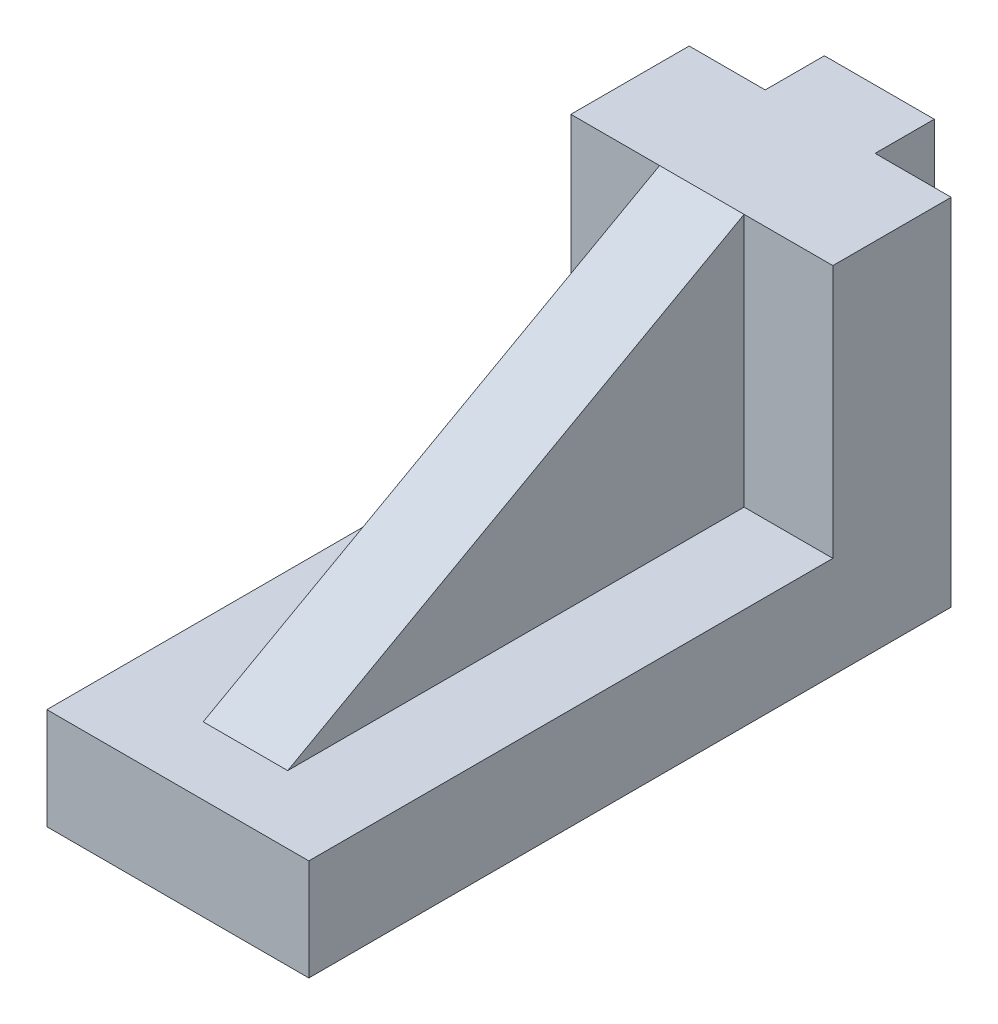
ISO-10303-21;
HEADER;
FILE_DESCRIPTION(('STEP AP214'),'2;1');
FILE_NAME('part.step','',(''),(''),'','','');
FILE_SCHEMA(('AUTOMOTIVE_DESIGN { 1 0 10303 214 1 1 1 1 }'));
ENDSEC;
DATA;
#1=APPLICATION_CONTEXT('core data for automotive mechanical design processes');
#2=APPLICATION_PROTOCOL_DEFINITION('international standard','automotive_design',2000,#1);
#3=PRODUCT_CONTEXT('',#1,'mechanical');
#4=PRODUCT('Part','Part','',(#3));
#5=PRODUCT_RELATED_PRODUCT_CATEGORY('part','',(#4));
#6=PRODUCT_DEFINITION_FORMATION('','',#4);
#7=PRODUCT_DEFINITION_CONTEXT('part definition',#1,'design');
#8=PRODUCT_DEFINITION('design','',#6,#7);
#9=PRODUCT_DEFINITION_SHAPE('','',#8);
#10=(LENGTH_UNIT() NAMED_UNIT(*) SI_UNIT(.MILLI.,.METRE.));
#11=(NAMED_UNIT(*) PLANE_ANGLE_UNIT() SI_UNIT($,.RADIAN.));
#12=(NAMED_UNIT(*) SI_UNIT($,.STERADIAN.) SOLID_ANGLE_UNIT());
#13=UNCERTAINTY_MEASURE_WITH_UNIT(LENGTH_MEASURE(1.E-05),#10,'distance_accuracy_value','');
#14=(GEOMETRIC_REPRESENTATION_CONTEXT(3) GLOBAL_UNCERTAINTY_ASSIGNED_CONTEXT((#13)) GLOBAL_UNIT_ASSIGNED_CONTEXT((#10,
#11,#12)) REPRESENTATION_CONTEXT('',''));
#15=CARTESIAN_POINT('',(0.,0.,0.));
#16=DIRECTION('',(0.,0.,1.));
#17=DIRECTION('',(1.,0.,0.));
#18=AXIS2_PLACEMENT_3D('',#15,#16,#17);
#19=CARTESIAN_POINT('',(15.5,42.,14.));
#20=DIRECTION('',(0.,0.,-1.));
#21=DIRECTION('',(0.,1.,0.));
#22=AXIS2_PLACEMENT_3D('',#19,#20,#21);
#23=PLANE('',#22);
#24=DIRECTION('',(0.,-1.,0.));
#25=VECTOR('',#24,1.);
#26=CARTESIAN_POINT('',(-5.,42.,14.));
#27=LINE('',#26,#25);
#28=CARTESIAN_POINT('',(-5.,42.,14.));
#29=VERTEX_POINT('',#28);
#30=CARTESIAN_POINT('',(-5.,12.,14.));
#31=VERTEX_POINT('',#30);
#32=EDGE_CURVE('E53',#29,#31,#27,.T.);
#33=ORIENTED_EDGE('',*,*,#32,.F.);
#34=DIRECTION('',(-1.,0.,0.));
#35=VECTOR('',#34,1.);
#36=CARTESIAN_POINT('',(15.5,42.,14.));
#37=LINE('',#36,#35);
#38=CARTESIAN_POINT('',(-15.5,42.,14.));
#39=VERTEX_POINT('',#38);
#40=EDGE_CURVE('E226',#29,#39,#37,.T.);
#41=ORIENTED_EDGE('',*,*,#40,.T.);
#42=DIRECTION('',(0.,-1.,0.));
#43=VECTOR('',#42,1.);
#44=CARTESIAN_POINT('',(-15.5,42.,14.));
#45=LINE('',#44,#43);
#46=CARTESIAN_POINT('',(-15.5,12.,14.));
#47=VERTEX_POINT('',#46);
#48=EDGE_CURVE('E207',#39,#47,#45,.T.);
#49=ORIENTED_EDGE('',*,*,#48,.T.);
#50=DIRECTION('',(-1.,0.,0.));
#51=VECTOR('',#50,1.);
#52=CARTESIAN_POINT('',(15.5,12.,14.));
#53=LINE('',#52,#51);
#54=EDGE_CURVE('E224',#31,#47,#53,.T.);
#55=ORIENTED_EDGE('',*,*,#54,.F.);
#56=EDGE_LOOP('',(#33,#41,#49,#55));
#57=FACE_BOUND('',#56,.T.);
#58=ADVANCED_FACE('F38',(#57),#23,.F.);
#59=CARTESIAN_POINT('',(15.5,0.,0.));
#60=DIRECTION('',(0.,0.,1.));
#61=DIRECTION('',(1.,0.,0.));
#62=AXIS2_PLACEMENT_3D('',#59,#60,#61);
#63=PLANE('',#62);
#64=DIRECTION('',(0.,1.,0.));
#65=VECTOR('',#64,1.);
#66=CARTESIAN_POINT('',(-6.5,-14.7648230602334,0.));
#67=LINE('',#66,#65);
#68=CARTESIAN_POINT('',(-6.5,0.,0.));
#69=VERTEX_POINT('',#68);
#70=CARTESIAN_POINT('',(-6.5,42.,0.));
#71=VERTEX_POINT('',#70);
#72=EDGE_CURVE('E178',#69,#71,#67,.T.);
#73=ORIENTED_EDGE('',*,*,#72,.F.);
#74=DIRECTION('',(-1.,0.,0.));
#75=VECTOR('',#74,1.);
#76=CARTESIAN_POINT('',(15.5,0.,0.));
#77=LINE('',#76,#75);
#78=CARTESIAN_POINT('',(-15.5,0.,0.));
#79=VERTEX_POINT('',#78);
#80=EDGE_CURVE('E201',#69,#79,#77,.T.);
#81=ORIENTED_EDGE('',*,*,#80,.T.);
#82=DIRECTION('',(0.,1.,0.));
#83=VECTOR('',#82,1.);
#84=CARTESIAN_POINT('',(-15.5,0.,0.));
#85=LINE('',#84,#83);
#86=CARTESIAN_POINT('',(-15.5,42.,0.));
#87=VERTEX_POINT('',#86);
#88=EDGE_CURVE('E170',#79,#87,#85,.T.);
#89=ORIENTED_EDGE('',*,*,#88,.T.);
#90=DIRECTION('',(-1.,0.,0.));
#91=VECTOR('',#90,1.);
#92=CARTESIAN_POINT('',(15.5,42.,0.));
#93=LINE('',#92,#91);
#94=EDGE_CURVE('E46',#71,#87,#93,.T.);
#95=ORIENTED_EDGE('',*,*,#94,.F.);
#96=EDGE_LOOP('',(#73,#81,#89,#95));
#97=FACE_BOUND('',#96,.T.);
#98=ADVANCED_FACE('F262',(#97),#63,.F.);
#99=CARTESIAN_POINT('',(15.5,0.,0.));
#100=VERTEX_POINT('',#99);
#101=CARTESIAN_POINT('',(6.5,0.,0.));
#102=VERTEX_POINT('',#101);
#103=EDGE_CURVE('E217',#100,#102,#77,.T.);
#104=ORIENTED_EDGE('',*,*,#103,.T.);
#105=DIRECTION('',(0.,1.,0.));
#106=VECTOR('',#105,1.);
#107=CARTESIAN_POINT('',(6.5,-14.7648230602334,0.));
#108=LINE('',#107,#106);
#109=CARTESIAN_POINT('',(6.5,42.,0.));
#110=VERTEX_POINT('',#109);
#111=EDGE_CURVE('E183',#102,#110,#108,.T.);
#112=ORIENTED_EDGE('',*,*,#111,.T.);
#113=CARTESIAN_POINT('',(15.5,42.,0.));
#114=VERTEX_POINT('',#113);
#115=EDGE_CURVE('E11',#114,#110,#93,.T.);
#116=ORIENTED_EDGE('',*,*,#115,.F.);
#117=DIRECTION('',(0.,1.,0.));
#118=VECTOR('',#117,1.);
#119=CARTESIAN_POINT('',(15.5,0.,0.));
#120=LINE('',#119,#118);
#121=EDGE_CURVE('E187',#100,#114,#120,.T.);
#122=ORIENTED_EDGE('',*,*,#121,.F.);
#123=EDGE_LOOP('',(#104,#112,#116,#122));
#124=FACE_BOUND('',#123,.T.);
#125=ADVANCED_FACE('F40',(#124),#63,.F.);
#126=CARTESIAN_POINT('',(15.5,42.,0.));
#127=DIRECTION('',(0.,-1.,0.));
#128=DIRECTION('',(0.,0.,-1.));
#129=AXIS2_PLACEMENT_3D('',#126,#127,#128);
#130=PLANE('',#129);
#131=DIRECTION('',(-1.,0.,0.));
#132=VECTOR('',#131,1.);
#133=CARTESIAN_POINT('',(-6.5,42.,-7.));
#134=LINE('',#133,#132);
#135=CARTESIAN_POINT('',(6.5,42.,-7.));
#136=VERTEX_POINT('',#135);
#137=CARTESIAN_POINT('',(-6.5,42.,-7.));
#138=VERTEX_POINT('',#137);
#139=EDGE_CURVE('E176',#136,#138,#134,.T.);
#140=ORIENTED_EDGE('',*,*,#139,.T.);
#141=DIRECTION('',(0.,0.,1.));
#142=VECTOR('',#141,1.);
#143=CARTESIAN_POINT('',(-6.5,42.,0.));
#144=LINE('',#143,#142);
#145=EDGE_CURVE('E161',#138,#71,#144,.T.);
#146=ORIENTED_EDGE('',*,*,#145,.T.);
#147=ORIENTED_EDGE('',*,*,#94,.T.);
#148=DIRECTION('',(0.,0.,1.));
#149=VECTOR('',#148,1.);
#150=CARTESIAN_POINT('',(-15.5,42.,0.));
#151=LINE('',#150,#149);
#152=EDGE_CURVE('E204',#87,#39,#151,.T.);
#153=ORIENTED_EDGE('',*,*,#152,.T.);
#154=ORIENTED_EDGE('',*,*,#40,.F.);
#155=DIRECTION('',(-1.,0.,0.));
#156=VECTOR('',#155,1.);
#157=CARTESIAN_POINT('',(15.5,42.,14.));
#158=LINE('',#157,#156);
#159=CARTESIAN_POINT('',(5.,42.,14.));
#160=VERTEX_POINT('',#159);
#161=EDGE_CURVE('E60',#29,#160,#158,.F.);
#162=ORIENTED_EDGE('',*,*,#161,.T.);
#163=CARTESIAN_POINT('',(15.5,42.,14.));
#164=VERTEX_POINT('',#163);
#165=EDGE_CURVE('E227',#164,#160,#37,.T.);
#166=ORIENTED_EDGE('',*,*,#165,.F.);
#167=DIRECTION('',(0.,0.,1.));
#168=VECTOR('',#167,1.);
#169=CARTESIAN_POINT('',(15.5,42.,0.));
#170=LINE('',#169,#168);
#171=EDGE_CURVE('E190',#114,#164,#170,.T.);
#172=ORIENTED_EDGE('',*,*,#171,.F.);
#173=ORIENTED_EDGE('',*,*,#115,.T.);
#174=DIRECTION('',(0.,0.,-1.));
#175=VECTOR('',#174,1.);
#176=CARTESIAN_POINT('',(6.5,42.,0.));
#177=LINE('',#176,#175);
#178=EDGE_CURVE('E173',#110,#136,#177,.T.);
#179=ORIENTED_EDGE('',*,*,#178,.T.);
#180=EDGE_LOOP('',(#140,#146,#147,#153,#154,#162,#166,#172,#173,#179));
#181=FACE_BOUND('',#180,.T.);
#182=ADVANCED_FACE('F234',(#181),#130,.F.);
#183=ORIENTED_EDGE('',*,*,#165,.T.);
#184=DIRECTION('',(0.,-1.,0.));
#185=VECTOR('',#184,1.);
#186=CARTESIAN_POINT('',(5.,42.,14.));
#187=LINE('',#186,#185);
#188=CARTESIAN_POINT('',(5.,12.,14.));
#189=VERTEX_POINT('',#188);
#190=EDGE_CURVE('E150',#160,#189,#187,.T.);
#191=ORIENTED_EDGE('',*,*,#190,.T.);
#192=CARTESIAN_POINT('',(15.5,12.,14.));
#193=VERTEX_POINT('',#192);
#194=EDGE_CURVE('E225',#193,#189,#53,.T.);
#195=ORIENTED_EDGE('',*,*,#194,.F.);
#196=DIRECTION('',(0.,-1.,0.));
#197=VECTOR('',#196,1.);
#198=CARTESIAN_POINT('',(15.5,42.,14.));
#199=LINE('',#198,#197);
#200=EDGE_CURVE('E193',#164,#193,#199,.T.);
#201=ORIENTED_EDGE('',*,*,#200,.F.);
#202=EDGE_LOOP('',(#183,#191,#195,#201));
#203=FACE_BOUND('',#202,.T.);
#204=ADVANCED_FACE('F253',(#203),#23,.F.);
#205=CARTESIAN_POINT('',(15.5,12.,76.));
#206=DIRECTION('',(0.,-1.,0.));
#207=DIRECTION('',(0.,0.,-1.));
#208=AXIS2_PLACEMENT_3D('',#205,#206,#207);
#209=PLANE('',#208);
#210=ORIENTED_EDGE('',*,*,#194,.T.);
#211=DIRECTION('',(0.,0.,1.));
#212=VECTOR('',#211,1.);
#213=CARTESIAN_POINT('',(5.,12.,76.));
#214=LINE('',#213,#212);
#215=CARTESIAN_POINT('',(5.,12.,68.));
#216=VERTEX_POINT('',#215);
#217=EDGE_CURVE('E140',#189,#216,#214,.T.);
#218=ORIENTED_EDGE('',*,*,#217,.T.);
#219=DIRECTION('',(1.,0.,0.));
#220=VECTOR('',#219,1.);
#221=CARTESIAN_POINT('',(15.5,12.,68.));
#222=LINE('',#221,#220);
#223=CARTESIAN_POINT('',(-5.,12.,68.));
#224=VERTEX_POINT('',#223);
#225=EDGE_CURVE('E134',#216,#224,#222,.F.);
#226=ORIENTED_EDGE('',*,*,#225,.T.);
#227=DIRECTION('',(0.,0.,1.));
#228=VECTOR('',#227,1.);
#229=CARTESIAN_POINT('',(-5.,12.,76.));
#230=LINE('',#229,#228);
#231=EDGE_CURVE('E138',#31,#224,#230,.T.);
#232=ORIENTED_EDGE('',*,*,#231,.F.);
#233=ORIENTED_EDGE('',*,*,#54,.T.);
#234=DIRECTION('',(0.,0.,1.));
#235=VECTOR('',#234,1.);
#236=CARTESIAN_POINT('',(-15.5,12.,76.));
#237=LINE('',#236,#235);
#238=CARTESIAN_POINT('',(-15.5,12.,76.));
#239=VERTEX_POINT('',#238);
#240=EDGE_CURVE('E210',#47,#239,#237,.T.);
#241=ORIENTED_EDGE('',*,*,#240,.T.);
#242=DIRECTION('',(-1.,0.,0.));
#243=VECTOR('',#242,1.);
#244=CARTESIAN_POINT('',(15.5,12.,76.));
#245=LINE('',#244,#243);
#246=CARTESIAN_POINT('',(15.5,12.,76.));
#247=VERTEX_POINT('',#246);
#248=EDGE_CURVE('E221',#247,#239,#245,.T.);
#249=ORIENTED_EDGE('',*,*,#248,.F.);
#250=DIRECTION('',(0.,0.,1.));
#251=VECTOR('',#250,1.);
#252=CARTESIAN_POINT('',(15.5,12.,76.));
#253=LINE('',#252,#251);
#254=EDGE_CURVE('E195',#193,#247,#253,.T.);
#255=ORIENTED_EDGE('',*,*,#254,.F.);
#256=EDGE_LOOP('',(#210,#218,#226,#232,#233,#241,#249,#255));
#257=FACE_BOUND('',#256,.T.);
#258=ADVANCED_FACE('F137',(#257),#209,.F.);
#259=CARTESIAN_POINT('',(15.5,0.,76.));
#260=DIRECTION('',(0.,0.,-1.));
#261=DIRECTION('',(-1.,0.,0.));
#262=AXIS2_PLACEMENT_3D('',#259,#260,#261);
#263=PLANE('',#262);
#264=DIRECTION('',(0.,-1.,0.));
#265=VECTOR('',#264,1.);
#266=CARTESIAN_POINT('',(-15.5,0.,76.));
#267=LINE('',#266,#265);
#268=CARTESIAN_POINT('',(-15.5,0.,76.));
#269=VERTEX_POINT('',#268);
#270=EDGE_CURVE('E212',#239,#269,#267,.T.);
#271=ORIENTED_EDGE('',*,*,#270,.T.);
#272=DIRECTION('',(-1.,0.,0.));
#273=VECTOR('',#272,1.);
#274=CARTESIAN_POINT('',(15.5,0.,76.));
#275=LINE('',#274,#273);
#276=CARTESIAN_POINT('',(15.5,0.,76.));
#277=VERTEX_POINT('',#276);
#278=EDGE_CURVE('E219',#277,#269,#275,.T.);
#279=ORIENTED_EDGE('',*,*,#278,.F.);
#280=DIRECTION('',(0.,-1.,0.));
#281=VECTOR('',#280,1.);
#282=CARTESIAN_POINT('',(15.5,0.,76.));
#283=LINE('',#282,#281);
#284=EDGE_CURVE('E197',#247,#277,#283,.T.);
#285=ORIENTED_EDGE('',*,*,#284,.F.);
#286=ORIENTED_EDGE('',*,*,#248,.T.);
#287=EDGE_LOOP('',(#271,#279,#285,#286));
#288=FACE_BOUND('',#287,.T.);
#289=ADVANCED_FACE('F244',(#288),#263,.F.);
#290=CARTESIAN_POINT('',(15.5,0.,0.));
#291=DIRECTION('',(0.,1.,0.));
#292=DIRECTION('',(0.,0.,1.));
#293=AXIS2_PLACEMENT_3D('',#290,#291,#292);
#294=PLANE('',#293);
#295=ORIENTED_EDGE('',*,*,#278,.T.);
#296=DIRECTION('',(0.,0.,-1.));
#297=VECTOR('',#296,1.);
#298=CARTESIAN_POINT('',(-15.5,0.,0.));
#299=LINE('',#298,#297);
#300=EDGE_CURVE('E191',#269,#79,#299,.T.);
#301=ORIENTED_EDGE('',*,*,#300,.T.);
#302=ORIENTED_EDGE('',*,*,#80,.F.);
#303=DIRECTION('',(0.,0.,-1.));
#304=VECTOR('',#303,1.);
#305=CARTESIAN_POINT('',(-6.5,0.,0.));
#306=LINE('',#305,#304);
#307=CARTESIAN_POINT('',(-6.5,0.,-7.));
#308=VERTEX_POINT('',#307);
#309=EDGE_CURVE('E168',#69,#308,#306,.T.);
#310=ORIENTED_EDGE('',*,*,#309,.T.);
#311=DIRECTION('',(1.,0.,0.));
#312=VECTOR('',#311,1.);
#313=CARTESIAN_POINT('',(-6.5,0.,-7.));
#314=LINE('',#313,#312);
#315=CARTESIAN_POINT('',(6.5,0.,-7.));
#316=VERTEX_POINT('',#315);
#317=EDGE_CURVE('E165',#308,#316,#314,.T.);
#318=ORIENTED_EDGE('',*,*,#317,.T.);
#319=DIRECTION('',(0.,0.,1.));
#320=VECTOR('',#319,1.);
#321=CARTESIAN_POINT('',(6.5,0.,0.));
#322=LINE('',#321,#320);
#323=EDGE_CURVE('E162',#316,#102,#322,.T.);
#324=ORIENTED_EDGE('',*,*,#323,.T.);
#325=ORIENTED_EDGE('',*,*,#103,.F.);
#326=DIRECTION('',(0.,0.,-1.));
#327=VECTOR('',#326,1.);
#328=CARTESIAN_POINT('',(15.5,0.,0.));
#329=LINE('',#328,#327);
#330=EDGE_CURVE('E199',#277,#100,#329,.T.);
#331=ORIENTED_EDGE('',*,*,#330,.F.);
#332=EDGE_LOOP('',(#295,#301,#302,#310,#318,#324,#325,#331));
#333=FACE_BOUND('',#332,.T.);
#334=ADVANCED_FACE('F276',(#333),#294,.F.);
#335=CARTESIAN_POINT('',(15.5,0.,0.));
#336=DIRECTION('',(1.,0.,0.));
#337=DIRECTION('',(0.,0.,-1.));
#338=AXIS2_PLACEMENT_3D('',#335,#336,#337);
#339=PLANE('',#338);
#340=ORIENTED_EDGE('',*,*,#121,.T.);
#341=ORIENTED_EDGE('',*,*,#171,.T.);
#342=ORIENTED_EDGE('',*,*,#200,.T.);
#343=ORIENTED_EDGE('',*,*,#254,.T.);
#344=ORIENTED_EDGE('',*,*,#284,.T.);
#345=ORIENTED_EDGE('',*,*,#330,.T.);
#346=EDGE_LOOP('',(#340,#341,#342,#343,#344,#345));
#347=FACE_BOUND('',#346,.T.);
#348=ADVANCED_FACE('F248',(#347),#339,.T.);
#349=CARTESIAN_POINT('',(-15.5,0.,0.));
#350=DIRECTION('',(1.,0.,0.));
#351=DIRECTION('',(0.,0.,-1.));
#352=AXIS2_PLACEMENT_3D('',#349,#350,#351);
#353=PLANE('',#352);
#354=ORIENTED_EDGE('',*,*,#88,.F.);
#355=ORIENTED_EDGE('',*,*,#300,.F.);
#356=ORIENTED_EDGE('',*,*,#270,.F.);
#357=ORIENTED_EDGE('',*,*,#240,.F.);
#358=ORIENTED_EDGE('',*,*,#48,.F.);
#359=ORIENTED_EDGE('',*,*,#152,.F.);
#360=EDGE_LOOP('',(#354,#355,#356,#357,#358,#359));
#361=FACE_BOUND('',#360,.T.);
#362=ADVANCED_FACE('F237',(#361),#353,.F.);
#363=CARTESIAN_POINT('',(-6.5,-14.7648230602334,0.));
#364=DIRECTION('',(-1.,0.,0.));
#365=DIRECTION('',(0.,0.,1.));
#366=AXIS2_PLACEMENT_3D('',#363,#364,#365);
#367=PLANE('',#366);
#368=ORIENTED_EDGE('',*,*,#309,.F.);
#369=ORIENTED_EDGE('',*,*,#72,.T.);
#370=ORIENTED_EDGE('',*,*,#145,.F.);
#371=DIRECTION('',(0.,1.,0.));
#372=VECTOR('',#371,1.);
#373=CARTESIAN_POINT('',(-6.5,-14.7648230602334,-7.));
#374=LINE('',#373,#372);
#375=EDGE_CURVE('E166',#308,#138,#374,.T.);
#376=ORIENTED_EDGE('',*,*,#375,.F.);
#377=EDGE_LOOP('',(#368,#369,#370,#376));
#378=FACE_BOUND('',#377,.T.);
#379=ADVANCED_FACE('F279',(#378),#367,.T.);
#380=CARTESIAN_POINT('',(-6.5,-14.7648230602334,-7.));
#381=DIRECTION('',(0.,0.,-1.));
#382=DIRECTION('',(-1.,0.,0.));
#383=AXIS2_PLACEMENT_3D('',#380,#381,#382);
#384=PLANE('',#383);
#385=DIRECTION('',(0.,1.,0.));
#386=VECTOR('',#385,1.);
#387=CARTESIAN_POINT('',(6.5,-14.7648230602334,-7.));
#388=LINE('',#387,#386);
#389=EDGE_CURVE('E181',#316,#136,#388,.T.);
#390=ORIENTED_EDGE('',*,*,#389,.F.);
#391=ORIENTED_EDGE('',*,*,#317,.F.);
#392=ORIENTED_EDGE('',*,*,#375,.T.);
#393=ORIENTED_EDGE('',*,*,#139,.F.);
#394=EDGE_LOOP('',(#390,#391,#392,#393));
#395=FACE_BOUND('',#394,.T.);
#396=ADVANCED_FACE('F283',(#395),#384,.T.);
#397=CARTESIAN_POINT('',(6.5,-14.7648230602334,0.));
#398=DIRECTION('',(1.,0.,0.));
#399=DIRECTION('',(0.,0.,-1.));
#400=AXIS2_PLACEMENT_3D('',#397,#398,#399);
#401=PLANE('',#400);
#402=ORIENTED_EDGE('',*,*,#323,.F.);
#403=ORIENTED_EDGE('',*,*,#389,.T.);
#404=ORIENTED_EDGE('',*,*,#178,.F.);
#405=ORIENTED_EDGE('',*,*,#111,.F.);
#406=EDGE_LOOP('',(#402,#403,#404,#405));
#407=FACE_BOUND('',#406,.T.);
#408=ADVANCED_FACE('F287',(#407),#401,.T.);
#409=CARTESIAN_POINT('',(0.,12.,68.));
#410=DIRECTION('',(0.,-0.874157276121538,-0.485642931178632));
#411=DIRECTION('',(0.,0.485642931178632,-0.874157276121538));
#412=AXIS2_PLACEMENT_3D('',#409,#410,#411);
#413=PLANE('',#412);
#414=ORIENTED_EDGE('',*,*,#161,.F.);
#415=DIRECTION('',(0.,0.485642931178632,-0.874157276121538));
#416=VECTOR('',#415,1.);
#417=CARTESIAN_POINT('',(-5.,12.,68.));
#418=LINE('',#417,#416);
#419=EDGE_CURVE('E149',#224,#29,#418,.T.);
#420=ORIENTED_EDGE('',*,*,#419,.F.);
#421=ORIENTED_EDGE('',*,*,#225,.F.);
#422=DIRECTION('',(0.,0.485642931178632,-0.874157276121538));
#423=VECTOR('',#422,1.);
#424=CARTESIAN_POINT('',(5.,12.,68.));
#425=LINE('',#424,#423);
#426=EDGE_CURVE('E153',#216,#160,#425,.T.);
#427=ORIENTED_EDGE('',*,*,#426,.T.);
#428=EDGE_LOOP('',(#414,#420,#421,#427));
#429=FACE_BOUND('',#428,.T.);
#430=ADVANCED_FACE('F152',(#429),#413,.F.);
#431=CARTESIAN_POINT('',(5.,21.,34.5));
#432=DIRECTION('',(1.,0.,0.));
#433=DIRECTION('',(0.,0.,-1.));
#434=AXIS2_PLACEMENT_3D('',#431,#432,#433);
#435=PLANE('',#434);
#436=ORIENTED_EDGE('',*,*,#217,.F.);
#437=ORIENTED_EDGE('',*,*,#190,.F.);
#438=ORIENTED_EDGE('',*,*,#426,.F.);
#439=EDGE_LOOP('',(#436,#437,#438));
#440=FACE_BOUND('',#439,.T.);
#441=ADVANCED_FACE('F252',(#440),#435,.T.);
#442=CARTESIAN_POINT('',(-5.,21.,34.5));
#443=DIRECTION('',(1.,0.,0.));
#444=DIRECTION('',(0.,0.,-1.));
#445=AXIS2_PLACEMENT_3D('',#442,#443,#444);
#446=PLANE('',#445);
#447=ORIENTED_EDGE('',*,*,#32,.T.);
#448=ORIENTED_EDGE('',*,*,#231,.T.);
#449=ORIENTED_EDGE('',*,*,#419,.T.);
#450=EDGE_LOOP('',(#447,#448,#449));
#451=FACE_BOUND('',#450,.T.);
#452=ADVANCED_FACE('F148',(#451),#446,.F.);
#453=CLOSED_SHELL('',(#58,#98,#125,#182,#204,#258,#289,#334,#348,#362,#379,#396,#408,#430,#441,#452));
#454=MANIFOLD_SOLID_BREP('B2',#453);
#455=ADVANCED_BREP_SHAPE_REPRESENTATION('',(#18,#454),#14);
#456=SHAPE_DEFINITION_REPRESENTATION(#9,#455);
ENDSEC;
END-ISO-10303-21;
